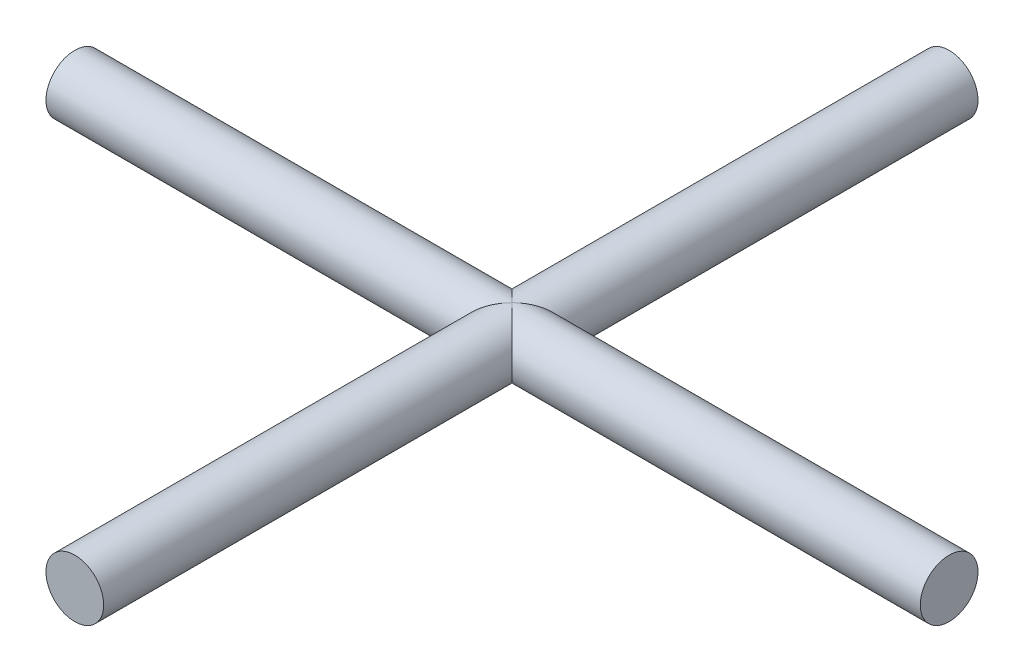
ISO-10303-21;
HEADER;
FILE_DESCRIPTION(('STEP AP214'),'2;1');
FILE_NAME('part.step','',(''),(''),'','','');
FILE_SCHEMA(('AUTOMOTIVE_DESIGN { 1 0 10303 214 1 1 1 1 }'));
ENDSEC;
DATA;
#1=APPLICATION_CONTEXT('core data for automotive mechanical design processes');
#2=APPLICATION_PROTOCOL_DEFINITION('international standard','automotive_design',2000,#1);
#3=PRODUCT_CONTEXT('',#1,'mechanical');
#4=PRODUCT('Part','Part','',(#3));
#5=PRODUCT_RELATED_PRODUCT_CATEGORY('part','',(#4));
#6=PRODUCT_DEFINITION_FORMATION('','',#4);
#7=PRODUCT_DEFINITION_CONTEXT('part definition',#1,'design');
#8=PRODUCT_DEFINITION('design','',#6,#7);
#9=PRODUCT_DEFINITION_SHAPE('','',#8);
#10=(LENGTH_UNIT() NAMED_UNIT(*) SI_UNIT(.MILLI.,.METRE.));
#11=(NAMED_UNIT(*) PLANE_ANGLE_UNIT() SI_UNIT($,.RADIAN.));
#12=(NAMED_UNIT(*) SI_UNIT($,.STERADIAN.) SOLID_ANGLE_UNIT());
#13=UNCERTAINTY_MEASURE_WITH_UNIT(LENGTH_MEASURE(1.E-05),#10,'distance_accuracy_value','');
#14=(GEOMETRIC_REPRESENTATION_CONTEXT(3) GLOBAL_UNCERTAINTY_ASSIGNED_CONTEXT((#13)) GLOBAL_UNIT_ASSIGNED_CONTEXT((#10,
#11,#12)) REPRESENTATION_CONTEXT('',''));
#15=CARTESIAN_POINT('',(0.,0.,0.));
#16=DIRECTION('',(0.,0.,1.));
#17=DIRECTION('',(1.,0.,0.));
#18=AXIS2_PLACEMENT_3D('',#15,#16,#17);
#19=CARTESIAN_POINT('',(0.,0.,-37.5));
#20=DIRECTION('',(0.,0.,1.));
#21=DIRECTION('',(1.,0.,0.));
#22=AXIS2_PLACEMENT_3D('',#19,#20,#21);
#23=CYLINDRICAL_SURFACE('',#22,2.475);
#24=CARTESIAN_POINT('',(0.,0.,0.));
#25=DIRECTION('',(0.707106781186549,0.,0.707106781186546));
#26=DIRECTION('',(-0.707106781186546,0.,0.707106781186549));
#27=AXIS2_PLACEMENT_3D('',#24,#25,#26);
#28=ELLIPSE('',#27,3.50017856687342,2.475);
#29=CARTESIAN_POINT('',(0.,-2.475,0.));
#30=VERTEX_POINT('',#29);
#31=CARTESIAN_POINT('',(0.,2.475,0.));
#32=VERTEX_POINT('',#31);
#33=EDGE_CURVE('E40',#30,#32,#28,.T.);
#34=ORIENTED_EDGE('',*,*,#33,.F.);
#35=CARTESIAN_POINT('',(0.,0.,0.));
#36=DIRECTION('',(-0.707106781186546,0.,0.707106781186549));
#37=DIRECTION('',(0.707106781186549,0.,0.707106781186546));
#38=AXIS2_PLACEMENT_3D('',#35,#36,#37);
#39=ELLIPSE('',#38,3.5001785668734,2.475);
#40=EDGE_CURVE('E52',#32,#30,#39,.T.);
#41=ORIENTED_EDGE('',*,*,#40,.F.);
#42=EDGE_LOOP('',(#34,#41));
#43=FACE_BOUND('',#42,.T.);
#44=CARTESIAN_POINT('',(0.,0.,-37.5));
#45=DIRECTION('',(0.,0.,1.));
#46=DIRECTION('',(1.,0.,0.));
#47=AXIS2_PLACEMENT_3D('',#44,#45,#46);
#48=CIRCLE('',#47,2.475);
#49=CARTESIAN_POINT('',(2.475,0.,-37.5));
#50=VERTEX_POINT('',#49);
#51=EDGE_CURVE('E59',#50,#50,#48,.T.);
#52=ORIENTED_EDGE('',*,*,#51,.T.);
#53=EDGE_LOOP('',(#52));
#54=FACE_BOUND('',#53,.T.);
#55=ADVANCED_FACE('F33',(#43,#54),#23,.T.);
#56=CARTESIAN_POINT('',(0.,0.,-37.5));
#57=DIRECTION('',(0.,0.,1.));
#58=DIRECTION('',(1.,0.,0.));
#59=AXIS2_PLACEMENT_3D('',#56,#57,#58);
#60=PLANE('',#59);
#61=ORIENTED_EDGE('',*,*,#51,.F.);
#62=EDGE_LOOP('',(#61));
#63=FACE_BOUND('',#62,.T.);
#64=ADVANCED_FACE('F82',(#63),#60,.F.);
#65=CARTESIAN_POINT('',(37.5,0.,-1.30930550206618E-13));
#66=DIRECTION('',(1.,0.,0.));
#67=DIRECTION('',(0.,0.,-1.));
#68=AXIS2_PLACEMENT_3D('',#65,#66,#67);
#69=PLANE('',#68);
#70=CARTESIAN_POINT('',(37.5,0.,-1.30930550206618E-13));
#71=DIRECTION('',(1.,0.,0.));
#72=DIRECTION('',(0.,0.,-1.));
#73=AXIS2_PLACEMENT_3D('',#70,#71,#72);
#74=CIRCLE('',#73,2.475);
#75=CARTESIAN_POINT('',(37.5,0.,-2.47500000000013));
#76=VERTEX_POINT('',#75);
#77=EDGE_CURVE('E72',#76,#76,#74,.T.);
#78=ORIENTED_EDGE('',*,*,#77,.T.);
#79=EDGE_LOOP('',(#78));
#80=FACE_BOUND('',#79,.T.);
#81=ADVANCED_FACE('F84',(#80),#69,.T.);
#82=CARTESIAN_POINT('',(-37.5,0.,1.30930550206618E-13));
#83=DIRECTION('',(1.,0.,0.));
#84=DIRECTION('',(0.,0.,-1.));
#85=AXIS2_PLACEMENT_3D('',#82,#83,#84);
#86=CYLINDRICAL_SURFACE('',#85,2.475);
#87=ORIENTED_EDGE('',*,*,#77,.F.);
#88=EDGE_LOOP('',(#87));
#89=FACE_BOUND('',#88,.T.);
#90=CARTESIAN_POINT('',(0.,0.,0.));
#91=DIRECTION('',(-0.707106781186546,0.,0.707106781186549));
#92=DIRECTION('',(0.707106781186549,0.,0.707106781186546));
#93=AXIS2_PLACEMENT_3D('',#90,#91,#92);
#94=ELLIPSE('',#93,3.5001785668734,2.475);
#95=EDGE_CURVE('E46',#32,#30,#94,.F.);
#96=ORIENTED_EDGE('',*,*,#95,.T.);
#97=ORIENTED_EDGE('',*,*,#33,.T.);
#98=EDGE_LOOP('',(#96,#97));
#99=FACE_BOUND('',#98,.T.);
#100=ADVANCED_FACE('F61',(#89,#99),#86,.T.);
#101=CARTESIAN_POINT('',(0.,0.,37.5));
#102=DIRECTION('',(0.,0.,1.));
#103=DIRECTION('',(1.,0.,0.));
#104=AXIS2_PLACEMENT_3D('',#101,#102,#103);
#105=PLANE('',#104);
#106=CARTESIAN_POINT('',(0.,0.,37.5));
#107=DIRECTION('',(0.,0.,1.));
#108=DIRECTION('',(1.,0.,0.));
#109=AXIS2_PLACEMENT_3D('',#106,#107,#108);
#110=CIRCLE('',#109,2.475);
#111=CARTESIAN_POINT('',(2.475,0.,37.5));
#112=VERTEX_POINT('',#111);
#113=EDGE_CURVE('E71',#112,#112,#110,.T.);
#114=ORIENTED_EDGE('',*,*,#113,.T.);
#115=EDGE_LOOP('',(#114));
#116=FACE_BOUND('',#115,.T.);
#117=ADVANCED_FACE('F92',(#116),#105,.T.);
#118=CARTESIAN_POINT('',(0.,0.,0.));
#119=DIRECTION('',(0.707106781186549,0.,0.707106781186546));
#120=DIRECTION('',(-0.707106781186546,0.,0.707106781186549));
#121=AXIS2_PLACEMENT_3D('',#118,#119,#120);
#122=ELLIPSE('',#121,3.50017856687342,2.475);
#123=EDGE_CURVE('E11',#30,#32,#122,.F.);
#124=ORIENTED_EDGE('',*,*,#123,.F.);
#125=ORIENTED_EDGE('',*,*,#95,.F.);
#126=EDGE_LOOP('',(#124,#125));
#127=FACE_BOUND('',#126,.T.);
#128=ORIENTED_EDGE('',*,*,#113,.F.);
#129=EDGE_LOOP('',(#128));
#130=FACE_BOUND('',#129,.T.);
#131=ADVANCED_FACE('F57',(#127,#130),#23,.T.);
#132=ORIENTED_EDGE('',*,*,#40,.T.);
#133=ORIENTED_EDGE('',*,*,#123,.T.);
#134=EDGE_LOOP('',(#132,#133));
#135=FACE_BOUND('',#134,.T.);
#136=CARTESIAN_POINT('',(-37.5,0.,1.30930550206618E-13));
#137=DIRECTION('',(1.,0.,0.));
#138=DIRECTION('',(0.,0.,-1.));
#139=AXIS2_PLACEMENT_3D('',#136,#137,#138);
#140=CIRCLE('',#139,2.475);
#141=CARTESIAN_POINT('',(-37.5,0.,-2.47499999999987));
#142=VERTEX_POINT('',#141);
#143=EDGE_CURVE('E69',#142,#142,#140,.T.);
#144=ORIENTED_EDGE('',*,*,#143,.T.);
#145=EDGE_LOOP('',(#144));
#146=FACE_BOUND('',#145,.T.);
#147=ADVANCED_FACE('F62',(#135,#146),#86,.T.);
#148=CARTESIAN_POINT('',(-37.5,0.,1.30930550206618E-13));
#149=DIRECTION('',(1.,0.,0.));
#150=DIRECTION('',(0.,0.,-1.));
#151=AXIS2_PLACEMENT_3D('',#148,#149,#150);
#152=PLANE('',#151);
#153=ORIENTED_EDGE('',*,*,#143,.F.);
#154=EDGE_LOOP('',(#153));
#155=FACE_BOUND('',#154,.T.);
#156=ADVANCED_FACE('F65',(#155),#152,.F.);
#157=CLOSED_SHELL('',(#55,#64,#81,#100,#117,#131,#147,#156));
#158=MANIFOLD_SOLID_BREP('B2',#157);
#159=ADVANCED_BREP_SHAPE_REPRESENTATION('',(#18,#158),#14);
#160=SHAPE_DEFINITION_REPRESENTATION(#9,#159);
ENDSEC;
END-ISO-10303-21;
